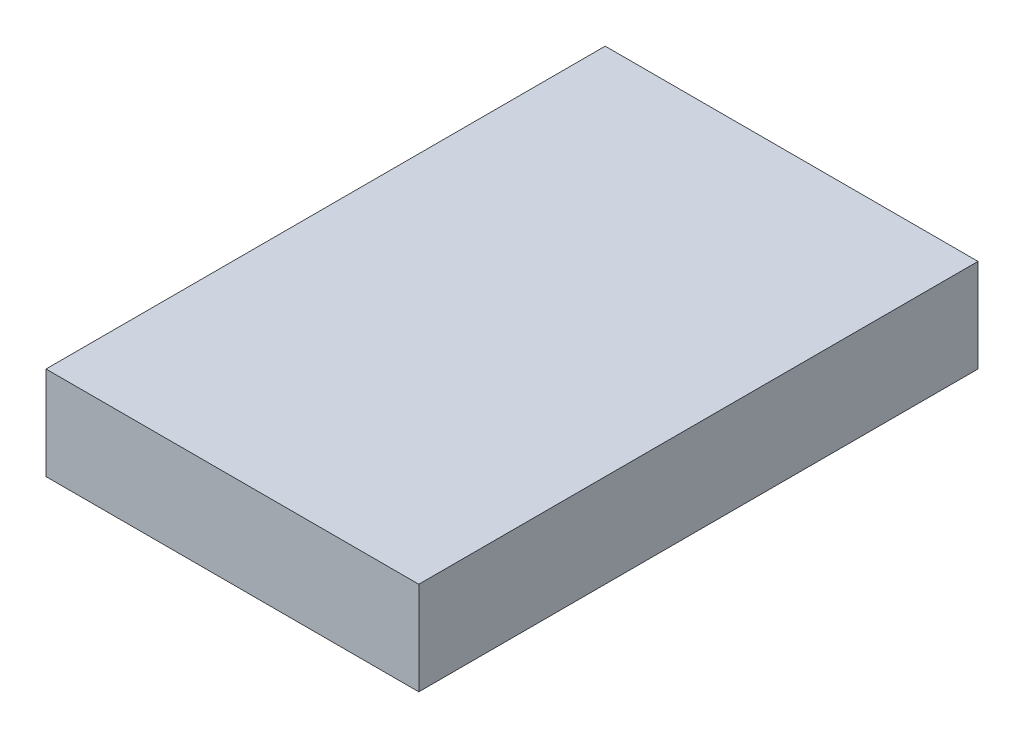
ISO-10303-21;
HEADER;
FILE_DESCRIPTION(('STEP AP214'),'2;1');
FILE_NAME('part.step','',(''),(''),'','','');
FILE_SCHEMA(('AUTOMOTIVE_DESIGN { 1 0 10303 214 1 1 1 1 }'));
ENDSEC;
DATA;
#1=APPLICATION_CONTEXT('core data for automotive mechanical design processes');
#2=APPLICATION_PROTOCOL_DEFINITION('international standard','automotive_design',2000,#1);
#3=PRODUCT_CONTEXT('',#1,'mechanical');
#4=PRODUCT('Part','Part','',(#3));
#5=PRODUCT_RELATED_PRODUCT_CATEGORY('part','',(#4));
#6=PRODUCT_DEFINITION_FORMATION('','',#4);
#7=PRODUCT_DEFINITION_CONTEXT('part definition',#1,'design');
#8=PRODUCT_DEFINITION('design','',#6,#7);
#9=PRODUCT_DEFINITION_SHAPE('','',#8);
#10=(LENGTH_UNIT() NAMED_UNIT(*) SI_UNIT(.MILLI.,.METRE.));
#11=(NAMED_UNIT(*) PLANE_ANGLE_UNIT() SI_UNIT($,.RADIAN.));
#12=(NAMED_UNIT(*) SI_UNIT($,.STERADIAN.) SOLID_ANGLE_UNIT());
#13=UNCERTAINTY_MEASURE_WITH_UNIT(LENGTH_MEASURE(1.E-05),#10,'distance_accuracy_value','');
#14=(GEOMETRIC_REPRESENTATION_CONTEXT(3) GLOBAL_UNCERTAINTY_ASSIGNED_CONTEXT((#13)) GLOBAL_UNIT_ASSIGNED_CONTEXT((#10,
#11,#12)) REPRESENTATION_CONTEXT('',''));
#15=CARTESIAN_POINT('',(0.,0.,0.));
#16=DIRECTION('',(0.,0.,1.));
#17=DIRECTION('',(1.,0.,0.));
#18=AXIS2_PLACEMENT_3D('',#15,#16,#17);
#19=CARTESIAN_POINT('',(20.,5.,60.));
#20=DIRECTION('',(-1.,0.,0.));
#21=DIRECTION('',(0.,0.,1.));
#22=AXIS2_PLACEMENT_3D('',#19,#20,#21);
#23=PLANE('',#22);
#24=DIRECTION('',(0.,1.,0.));
#25=VECTOR('',#24,1.);
#26=CARTESIAN_POINT('',(20.,5.,0.));
#27=LINE('',#26,#25);
#28=CARTESIAN_POINT('',(20.,-5.,0.));
#29=VERTEX_POINT('',#28);
#30=CARTESIAN_POINT('',(20.,5.,0.));
#31=VERTEX_POINT('',#30);
#32=EDGE_CURVE('E106',#29,#31,#27,.T.);
#33=ORIENTED_EDGE('',*,*,#32,.T.);
#34=DIRECTION('',(0.,0.,-1.));
#35=VECTOR('',#34,1.);
#36=CARTESIAN_POINT('',(20.,5.,60.));
#37=LINE('',#36,#35);
#38=CARTESIAN_POINT('',(20.,5.,60.));
#39=VERTEX_POINT('',#38);
#40=EDGE_CURVE('E11',#39,#31,#37,.T.);
#41=ORIENTED_EDGE('',*,*,#40,.F.);
#42=DIRECTION('',(0.,1.,0.));
#43=VECTOR('',#42,1.);
#44=CARTESIAN_POINT('',(20.,5.,60.));
#45=LINE('',#44,#43);
#46=CARTESIAN_POINT('',(20.,-5.,60.));
#47=VERTEX_POINT('',#46);
#48=EDGE_CURVE('E94',#47,#39,#45,.T.);
#49=ORIENTED_EDGE('',*,*,#48,.F.);
#50=DIRECTION('',(0.,0.,-1.));
#51=VECTOR('',#50,1.);
#52=CARTESIAN_POINT('',(20.,-5.,60.));
#53=LINE('',#52,#51);
#54=EDGE_CURVE('E102',#47,#29,#53,.T.);
#55=ORIENTED_EDGE('',*,*,#54,.T.);
#56=EDGE_LOOP('',(#33,#41,#49,#55));
#57=FACE_BOUND('',#56,.T.);
#58=ADVANCED_FACE('F43',(#57),#23,.F.);
#59=CARTESIAN_POINT('',(-20.,5.,60.));
#60=DIRECTION('',(0.,-1.,0.));
#61=DIRECTION('',(0.,0.,-1.));
#62=AXIS2_PLACEMENT_3D('',#59,#60,#61);
#63=PLANE('',#62);
#64=DIRECTION('',(-1.,0.,0.));
#65=VECTOR('',#64,1.);
#66=CARTESIAN_POINT('',(-20.,5.,0.));
#67=LINE('',#66,#65);
#68=CARTESIAN_POINT('',(-20.,5.,0.));
#69=VERTEX_POINT('',#68);
#70=EDGE_CURVE('E98',#31,#69,#67,.T.);
#71=ORIENTED_EDGE('',*,*,#70,.T.);
#72=DIRECTION('',(0.,0.,-1.));
#73=VECTOR('',#72,1.);
#74=CARTESIAN_POINT('',(-20.,5.,60.));
#75=LINE('',#74,#73);
#76=CARTESIAN_POINT('',(-20.,5.,60.));
#77=VERTEX_POINT('',#76);
#78=EDGE_CURVE('E51',#77,#69,#75,.T.);
#79=ORIENTED_EDGE('',*,*,#78,.F.);
#80=DIRECTION('',(-1.,0.,0.));
#81=VECTOR('',#80,1.);
#82=CARTESIAN_POINT('',(-20.,5.,60.));
#83=LINE('',#82,#81);
#84=EDGE_CURVE('E89',#39,#77,#83,.T.);
#85=ORIENTED_EDGE('',*,*,#84,.F.);
#86=ORIENTED_EDGE('',*,*,#40,.T.);
#87=EDGE_LOOP('',(#71,#79,#85,#86));
#88=FACE_BOUND('',#87,.T.);
#89=ADVANCED_FACE('F97',(#88),#63,.F.);
#90=CARTESIAN_POINT('',(-20.,5.,60.));
#91=DIRECTION('',(1.,0.,0.));
#92=DIRECTION('',(0.,0.,-1.));
#93=AXIS2_PLACEMENT_3D('',#90,#91,#92);
#94=PLANE('',#93);
#95=DIRECTION('',(0.,-1.,0.));
#96=VECTOR('',#95,1.);
#97=CARTESIAN_POINT('',(-20.,5.,0.));
#98=LINE('',#97,#96);
#99=CARTESIAN_POINT('',(-20.,-5.,0.));
#100=VERTEX_POINT('',#99);
#101=EDGE_CURVE('E76',#69,#100,#98,.T.);
#102=ORIENTED_EDGE('',*,*,#101,.T.);
#103=DIRECTION('',(0.,0.,-1.));
#104=VECTOR('',#103,1.);
#105=CARTESIAN_POINT('',(-20.,-5.,60.));
#106=LINE('',#105,#104);
#107=CARTESIAN_POINT('',(-20.,-5.,60.));
#108=VERTEX_POINT('',#107);
#109=EDGE_CURVE('E99',#108,#100,#106,.T.);
#110=ORIENTED_EDGE('',*,*,#109,.F.);
#111=DIRECTION('',(0.,-1.,0.));
#112=VECTOR('',#111,1.);
#113=CARTESIAN_POINT('',(-20.,5.,60.));
#114=LINE('',#113,#112);
#115=EDGE_CURVE('E92',#77,#108,#114,.T.);
#116=ORIENTED_EDGE('',*,*,#115,.F.);
#117=ORIENTED_EDGE('',*,*,#78,.T.);
#118=EDGE_LOOP('',(#102,#110,#116,#117));
#119=FACE_BOUND('',#118,.T.);
#120=ADVANCED_FACE('F100',(#119),#94,.F.);
#121=CARTESIAN_POINT('',(-20.,-5.,60.));
#122=DIRECTION('',(0.,1.,0.));
#123=DIRECTION('',(0.,0.,1.));
#124=AXIS2_PLACEMENT_3D('',#121,#122,#123);
#125=PLANE('',#124);
#126=DIRECTION('',(1.,0.,0.));
#127=VECTOR('',#126,1.);
#128=CARTESIAN_POINT('',(-20.,-5.,0.));
#129=LINE('',#128,#127);
#130=EDGE_CURVE('E82',#100,#29,#129,.T.);
#131=ORIENTED_EDGE('',*,*,#130,.T.);
#132=ORIENTED_EDGE('',*,*,#54,.F.);
#133=DIRECTION('',(1.,0.,0.));
#134=VECTOR('',#133,1.);
#135=CARTESIAN_POINT('',(-20.,-5.,60.));
#136=LINE('',#135,#134);
#137=EDGE_CURVE('E59',#108,#47,#136,.T.);
#138=ORIENTED_EDGE('',*,*,#137,.F.);
#139=ORIENTED_EDGE('',*,*,#109,.T.);
#140=EDGE_LOOP('',(#131,#132,#138,#139));
#141=FACE_BOUND('',#140,.T.);
#142=ADVANCED_FACE('F114',(#141),#125,.F.);
#143=CARTESIAN_POINT('',(0.,0.,60.));
#144=DIRECTION('',(0.,0.,1.));
#145=DIRECTION('',(1.,0.,0.));
#146=AXIS2_PLACEMENT_3D('',#143,#144,#145);
#147=PLANE('',#146);
#148=ORIENTED_EDGE('',*,*,#48,.T.);
#149=ORIENTED_EDGE('',*,*,#84,.T.);
#150=ORIENTED_EDGE('',*,*,#115,.T.);
#151=ORIENTED_EDGE('',*,*,#137,.T.);
#152=EDGE_LOOP('',(#148,#149,#150,#151));
#153=FACE_BOUND('',#152,.T.);
#154=ADVANCED_FACE('F90',(#153),#147,.T.);
#155=CARTESIAN_POINT('',(0.,0.,0.));
#156=DIRECTION('',(0.,0.,1.));
#157=DIRECTION('',(1.,0.,0.));
#158=AXIS2_PLACEMENT_3D('',#155,#156,#157);
#159=PLANE('',#158);
#160=ORIENTED_EDGE('',*,*,#32,.F.);
#161=ORIENTED_EDGE('',*,*,#130,.F.);
#162=ORIENTED_EDGE('',*,*,#101,.F.);
#163=ORIENTED_EDGE('',*,*,#70,.F.);
#164=EDGE_LOOP('',(#160,#161,#162,#163));
#165=FACE_BOUND('',#164,.T.);
#166=ADVANCED_FACE('F117',(#165),#159,.F.);
#167=CLOSED_SHELL('',(#58,#89,#120,#142,#154,#166));
#168=CARTESIAN_POINT('',(0.,0.,50.));
#169=DIRECTION('',(0.,0.,-1.));
#170=DIRECTION('',(-1.,0.,0.));
#171=AXIS2_PLACEMENT_3D('',#168,#169,#170);
#172=PLANE('',#171);
#173=CARTESIAN_POINT('',(0.,0.,50.));
#174=DIRECTION('',(0.,0.,-1.));
#175=DIRECTION('',(-1.,0.,0.));
#176=AXIS2_PLACEMENT_3D('',#173,#174,#175);
#177=CIRCLE('',#176,0.5);
#178=CARTESIAN_POINT('',(-0.499999999999994,0.,50.));
#179=VERTEX_POINT('',#178);
#180=EDGE_CURVE('E203',#179,#179,#177,.T.);
#181=ORIENTED_EDGE('',*,*,#180,.T.);
#182=EDGE_LOOP('',(#181));
#183=FACE_BOUND('',#182,.T.);
#184=ADVANCED_FACE('F207',(#183),#172,.T.);
#185=CARTESIAN_POINT('',(0.,0.,5.99999999999998));
#186=DIRECTION('',(0.,0.,-1.));
#187=DIRECTION('',(-1.,0.,0.));
#188=AXIS2_PLACEMENT_3D('',#185,#186,#187);
#189=PLANE('',#188);
#190=CARTESIAN_POINT('',(0.,0.,5.99999999999998));
#191=DIRECTION('',(0.,0.,-1.));
#192=DIRECTION('',(-1.,0.,0.));
#193=AXIS2_PLACEMENT_3D('',#190,#191,#192);
#194=CIRCLE('',#193,0.5);
#195=CARTESIAN_POINT('',(-0.5,0.,5.99999999999998));
#196=VERTEX_POINT('',#195);
#197=EDGE_CURVE('E109',#196,#196,#194,.T.);
#198=ORIENTED_EDGE('',*,*,#197,.F.);
#199=EDGE_LOOP('',(#198));
#200=FACE_BOUND('',#199,.T.);
#201=ADVANCED_FACE('F212',(#200),#189,.F.);
#202=CARTESIAN_POINT('',(0.,0.,50.));
#203=DIRECTION('',(0.,0.,-1.));
#204=DIRECTION('',(-1.,0.,0.));
#205=AXIS2_PLACEMENT_3D('',#202,#203,#204);
#206=CYLINDRICAL_SURFACE('',#205,0.5);
#207=CARTESIAN_POINT('',(0.,0.,46.));
#208=DIRECTION('',(0.,0.,-1.));
#209=DIRECTION('',(-1.,0.,0.));
#210=AXIS2_PLACEMENT_3D('',#207,#208,#209);
#211=CIRCLE('',#210,0.5);
#212=CARTESIAN_POINT('',(-0.499999999999994,0.,46.));
#213=VERTEX_POINT('',#212);
#214=EDGE_CURVE('E200',#213,#213,#211,.T.);
#215=ORIENTED_EDGE('',*,*,#214,.T.);
#216=EDGE_LOOP('',(#215));
#217=FACE_BOUND('',#216,.T.);
#218=ORIENTED_EDGE('',*,*,#180,.F.);
#219=EDGE_LOOP('',(#218));
#220=FACE_BOUND('',#219,.T.);
#221=ADVANCED_FACE('F209',(#217,#220),#206,.F.);
#222=CARTESIAN_POINT('',(1.00000000000001,0.,46.));
#223=DIRECTION('',(0.,-1.,0.));
#224=DIRECTION('',(0.,0.,-1.));
#225=AXIS2_PLACEMENT_3D('',#222,#223,#224);
#226=TOROIDAL_SURFACE('',#225,0.999999999999999,0.5);
#227=CARTESIAN_POINT('',(1.00000000000001,0.,45.));
#228=DIRECTION('',(1.,0.,0.));
#229=DIRECTION('',(0.,0.,-1.));
#230=AXIS2_PLACEMENT_3D('',#227,#228,#229);
#231=CIRCLE('',#230,0.5);
#232=CARTESIAN_POINT('',(1.00000000000001,0.,44.5));
#233=VERTEX_POINT('',#232);
#234=EDGE_CURVE('E197',#233,#233,#231,.T.);
#235=CARTESIAN_POINT('',(1.00000000000001,0.,46.));
#236=DIRECTION('',(0.,-1.,0.));
#237=DIRECTION('',(0.,0.,-1.));
#238=AXIS2_PLACEMENT_3D('',#235,#236,#237);
#239=CIRCLE('',#238,1.5);
#240=EDGE_CURVE('',#213,#233,#239,.T.);
#241=ORIENTED_EDGE('',*,*,#214,.F.);
#242=ORIENTED_EDGE('',*,*,#234,.T.);
#243=ORIENTED_EDGE('',*,*,#240,.T.);
#244=ORIENTED_EDGE('',*,*,#240,.F.);
#245=EDGE_LOOP('',(#241,#243,#242,#244));
#246=FACE_BOUND('',#245,.T.);
#247=ADVANCED_FACE('F211',(#246),#226,.F.);
#248=CARTESIAN_POINT('',(1.00000000000001,0.,45.));
#249=DIRECTION('',(1.,0.,0.));
#250=DIRECTION('',(0.,0.,-1.));
#251=AXIS2_PLACEMENT_3D('',#248,#249,#250);
#252=CYLINDRICAL_SURFACE('',#251,0.5);
#253=CARTESIAN_POINT('',(15.,0.,45.));
#254=DIRECTION('',(1.,0.,0.));
#255=DIRECTION('',(0.,0.,-1.));
#256=AXIS2_PLACEMENT_3D('',#253,#254,#255);
#257=CIRCLE('',#256,0.5);
#258=CARTESIAN_POINT('',(15.,0.,45.5));
#259=VERTEX_POINT('',#258);
#260=EDGE_CURVE('E194',#259,#259,#257,.T.);
#261=ORIENTED_EDGE('',*,*,#260,.T.);
#262=EDGE_LOOP('',(#261));
#263=FACE_BOUND('',#262,.T.);
#264=ORIENTED_EDGE('',*,*,#234,.F.);
#265=EDGE_LOOP('',(#264));
#266=FACE_BOUND('',#265,.T.);
#267=ADVANCED_FACE('F220',(#263,#266),#252,.F.);
#268=CARTESIAN_POINT('',(15.,0.,43.5));
#269=DIRECTION('',(0.,1.,0.));
#270=DIRECTION('',(0.,0.,1.));
#271=AXIS2_PLACEMENT_3D('',#268,#269,#270);
#272=TOROIDAL_SURFACE('',#271,1.5,0.5);
#273=CARTESIAN_POINT('',(15.,0.,42.));
#274=DIRECTION('',(-1.,0.,0.));
#275=DIRECTION('',(0.,0.,1.));
#276=AXIS2_PLACEMENT_3D('',#273,#274,#275);
#277=CIRCLE('',#276,0.5);
#278=CARTESIAN_POINT('',(15.,0.,41.5));
#279=VERTEX_POINT('',#278);
#280=EDGE_CURVE('E191',#279,#279,#277,.T.);
#281=CARTESIAN_POINT('',(15.,0.,43.5));
#282=DIRECTION('',(0.,1.,0.));
#283=DIRECTION('',(0.,0.,1.));
#284=AXIS2_PLACEMENT_3D('',#281,#282,#283);
#285=CIRCLE('',#284,2.);
#286=EDGE_CURVE('',#259,#279,#285,.T.);
#287=ORIENTED_EDGE('',*,*,#260,.F.);
#288=ORIENTED_EDGE('',*,*,#280,.T.);
#289=ORIENTED_EDGE('',*,*,#286,.T.);
#290=ORIENTED_EDGE('',*,*,#286,.F.);
#291=EDGE_LOOP('',(#287,#289,#288,#290));
#292=FACE_BOUND('',#291,.T.);
#293=ADVANCED_FACE('F315',(#292),#272,.F.);
#294=CARTESIAN_POINT('',(15.,0.,42.));
#295=DIRECTION('',(-1.,0.,0.));
#296=DIRECTION('',(0.,0.,1.));
#297=AXIS2_PLACEMENT_3D('',#294,#295,#296);
#298=CYLINDRICAL_SURFACE('',#297,0.5);
#299=CARTESIAN_POINT('',(0.,0.,42.));
#300=DIRECTION('',(-1.,0.,0.));
#301=DIRECTION('',(0.,0.,1.));
#302=AXIS2_PLACEMENT_3D('',#299,#300,#301);
#303=CIRCLE('',#302,0.5);
#304=CARTESIAN_POINT('',(0.,0.,42.5));
#305=VERTEX_POINT('',#304);
#306=EDGE_CURVE('E188',#305,#305,#303,.T.);
#307=ORIENTED_EDGE('',*,*,#306,.T.);
#308=EDGE_LOOP('',(#307));
#309=FACE_BOUND('',#308,.T.);
#310=ORIENTED_EDGE('',*,*,#280,.F.);
#311=EDGE_LOOP('',(#310));
#312=FACE_BOUND('',#311,.T.);
#313=ADVANCED_FACE('F325',(#309,#312),#298,.F.);
#314=CARTESIAN_POINT('',(0.,0.,42.));
#315=DIRECTION('',(-1.,0.,0.));
#316=DIRECTION('',(0.,0.,1.));
#317=AXIS2_PLACEMENT_3D('',#314,#315,#316);
#318=CYLINDRICAL_SURFACE('',#317,0.5);
#319=CARTESIAN_POINT('',(-15.,0.,42.));
#320=DIRECTION('',(-1.,0.,0.));
#321=DIRECTION('',(0.,0.,1.));
#322=AXIS2_PLACEMENT_3D('',#319,#320,#321);
#323=CIRCLE('',#322,0.5);
#324=CARTESIAN_POINT('',(-15.,0.,42.5));
#325=VERTEX_POINT('',#324);
#326=EDGE_CURVE('E185',#325,#325,#323,.T.);
#327=ORIENTED_EDGE('',*,*,#326,.T.);
#328=EDGE_LOOP('',(#327));
#329=FACE_BOUND('',#328,.T.);
#330=ORIENTED_EDGE('',*,*,#306,.F.);
#331=EDGE_LOOP('',(#330));
#332=FACE_BOUND('',#331,.T.);
#333=ADVANCED_FACE('F335',(#329,#332),#318,.F.);
#334=CARTESIAN_POINT('',(-15.,0.,40.5));
#335=DIRECTION('',(0.,-1.,0.));
#336=DIRECTION('',(0.,0.,-1.));
#337=AXIS2_PLACEMENT_3D('',#334,#335,#336);
#338=TOROIDAL_SURFACE('',#337,1.5,0.5);
#339=CARTESIAN_POINT('',(-15.,0.,39.));
#340=DIRECTION('',(1.,0.,0.));
#341=DIRECTION('',(0.,0.,-1.));
#342=AXIS2_PLACEMENT_3D('',#339,#340,#341);
#343=CIRCLE('',#342,0.5);
#344=CARTESIAN_POINT('',(-15.,0.,38.5));
#345=VERTEX_POINT('',#344);
#346=EDGE_CURVE('E182',#345,#345,#343,.T.);
#347=CARTESIAN_POINT('',(-15.,0.,40.5));
#348=DIRECTION('',(0.,-1.,0.));
#349=DIRECTION('',(0.,0.,-1.));
#350=AXIS2_PLACEMENT_3D('',#347,#348,#349);
#351=CIRCLE('',#350,2.);
#352=EDGE_CURVE('',#325,#345,#351,.T.);
#353=ORIENTED_EDGE('',*,*,#326,.F.);
#354=ORIENTED_EDGE('',*,*,#346,.T.);
#355=ORIENTED_EDGE('',*,*,#352,.T.);
#356=ORIENTED_EDGE('',*,*,#352,.F.);
#357=EDGE_LOOP('',(#353,#355,#354,#356));
#358=FACE_BOUND('',#357,.T.);
#359=ADVANCED_FACE('F345',(#358),#338,.F.);
#360=CARTESIAN_POINT('',(-15.,0.,39.));
#361=DIRECTION('',(1.,0.,0.));
#362=DIRECTION('',(0.,0.,-1.));
#363=AXIS2_PLACEMENT_3D('',#360,#361,#362);
#364=CYLINDRICAL_SURFACE('',#363,0.5);
#365=CARTESIAN_POINT('',(15.,0.,39.));
#366=DIRECTION('',(1.,0.,0.));
#367=DIRECTION('',(0.,0.,-1.));
#368=AXIS2_PLACEMENT_3D('',#365,#366,#367);
#369=CIRCLE('',#368,0.5);
#370=CARTESIAN_POINT('',(15.,0.,39.5));
#371=VERTEX_POINT('',#370);
#372=EDGE_CURVE('E179',#371,#371,#369,.T.);
#373=ORIENTED_EDGE('',*,*,#372,.T.);
#374=EDGE_LOOP('',(#373));
#375=FACE_BOUND('',#374,.T.);
#376=ORIENTED_EDGE('',*,*,#346,.F.);
#377=EDGE_LOOP('',(#376));
#378=FACE_BOUND('',#377,.T.);
#379=ADVANCED_FACE('F355',(#375,#378),#364,.F.);
#380=CARTESIAN_POINT('',(15.,0.,37.5));
#381=DIRECTION('',(0.,1.,0.));
#382=DIRECTION('',(0.,0.,1.));
#383=AXIS2_PLACEMENT_3D('',#380,#381,#382);
#384=TOROIDAL_SURFACE('',#383,1.49999999999999,0.5);
#385=CARTESIAN_POINT('',(15.,0.,36.));
#386=DIRECTION('',(-1.,0.,0.));
#387=DIRECTION('',(0.,0.,1.));
#388=AXIS2_PLACEMENT_3D('',#385,#386,#387);
#389=CIRCLE('',#388,0.5);
#390=CARTESIAN_POINT('',(15.,0.,35.5));
#391=VERTEX_POINT('',#390);
#392=EDGE_CURVE('E176',#391,#391,#389,.T.);
#393=CARTESIAN_POINT('',(15.,0.,37.5));
#394=DIRECTION('',(0.,1.,0.));
#395=DIRECTION('',(0.,0.,1.));
#396=AXIS2_PLACEMENT_3D('',#393,#394,#395);
#397=CIRCLE('',#396,1.99999999999999);
#398=EDGE_CURVE('',#371,#391,#397,.T.);
#399=ORIENTED_EDGE('',*,*,#372,.F.);
#400=ORIENTED_EDGE('',*,*,#392,.T.);
#401=ORIENTED_EDGE('',*,*,#398,.T.);
#402=ORIENTED_EDGE('',*,*,#398,.F.);
#403=EDGE_LOOP('',(#399,#401,#400,#402));
#404=FACE_BOUND('',#403,.T.);
#405=ADVANCED_FACE('F365',(#404),#384,.F.);
#406=CARTESIAN_POINT('',(15.,0.,36.));
#407=DIRECTION('',(-1.,0.,0.));
#408=DIRECTION('',(0.,0.,1.));
#409=AXIS2_PLACEMENT_3D('',#406,#407,#408);
#410=CYLINDRICAL_SURFACE('',#409,0.5);
#411=CARTESIAN_POINT('',(-15.,0.,36.));
#412=DIRECTION('',(-1.,0.,0.));
#413=DIRECTION('',(0.,0.,1.));
#414=AXIS2_PLACEMENT_3D('',#411,#412,#413);
#415=CIRCLE('',#414,0.5);
#416=CARTESIAN_POINT('',(-15.,0.,36.5));
#417=VERTEX_POINT('',#416);
#418=EDGE_CURVE('E173',#417,#417,#415,.T.);
#419=ORIENTED_EDGE('',*,*,#418,.T.);
#420=EDGE_LOOP('',(#419));
#421=FACE_BOUND('',#420,.T.);
#422=ORIENTED_EDGE('',*,*,#392,.F.);
#423=EDGE_LOOP('',(#422));
#424=FACE_BOUND('',#423,.T.);
#425=ADVANCED_FACE('F375',(#421,#424),#410,.F.);
#426=CARTESIAN_POINT('',(-15.,0.,34.5));
#427=DIRECTION('',(0.,-1.,0.));
#428=DIRECTION('',(0.,0.,-1.));
#429=AXIS2_PLACEMENT_3D('',#426,#427,#428);
#430=TOROIDAL_SURFACE('',#429,1.5,0.5);
#431=CARTESIAN_POINT('',(-15.,0.,33.));
#432=DIRECTION('',(1.,0.,0.));
#433=DIRECTION('',(0.,0.,-1.));
#434=AXIS2_PLACEMENT_3D('',#431,#432,#433);
#435=CIRCLE('',#434,0.5);
#436=CARTESIAN_POINT('',(-15.,0.,32.5));
#437=VERTEX_POINT('',#436);
#438=EDGE_CURVE('E170',#437,#437,#435,.T.);
#439=CARTESIAN_POINT('',(-15.,0.,34.5));
#440=DIRECTION('',(0.,-1.,0.));
#441=DIRECTION('',(0.,0.,-1.));
#442=AXIS2_PLACEMENT_3D('',#439,#440,#441);
#443=CIRCLE('',#442,2.);
#444=EDGE_CURVE('',#417,#437,#443,.T.);
#445=ORIENTED_EDGE('',*,*,#418,.F.);
#446=ORIENTED_EDGE('',*,*,#438,.T.);
#447=ORIENTED_EDGE('',*,*,#444,.T.);
#448=ORIENTED_EDGE('',*,*,#444,.F.);
#449=EDGE_LOOP('',(#445,#447,#446,#448));
#450=FACE_BOUND('',#449,.T.);
#451=ADVANCED_FACE('F385',(#450),#430,.F.);
#452=CARTESIAN_POINT('',(-15.,0.,33.));
#453=DIRECTION('',(1.,0.,0.));
#454=DIRECTION('',(0.,0.,-1.));
#455=AXIS2_PLACEMENT_3D('',#452,#453,#454);
#456=CYLINDRICAL_SURFACE('',#455,0.5);
#457=CARTESIAN_POINT('',(15.3555796644881,0.,33.));
#458=DIRECTION('',(1.,0.,0.));
#459=DIRECTION('',(0.,0.,-1.));
#460=AXIS2_PLACEMENT_3D('',#457,#458,#459);
#461=CIRCLE('',#460,0.5);
#462=CARTESIAN_POINT('',(15.3555796644881,0.,33.5));
#463=VERTEX_POINT('',#462);
#464=EDGE_CURVE('E167',#463,#463,#461,.T.);
#465=ORIENTED_EDGE('',*,*,#464,.T.);
#466=EDGE_LOOP('',(#465));
#467=FACE_BOUND('',#466,.T.);
#468=ORIENTED_EDGE('',*,*,#438,.F.);
#469=EDGE_LOOP('',(#468));
#470=FACE_BOUND('',#469,.T.);
#471=ADVANCED_FACE('F395',(#467,#470),#456,.F.);
#472=CARTESIAN_POINT('',(15.3555796644881,0.,31.5));
#473=DIRECTION('',(0.,1.,0.));
#474=DIRECTION('',(0.,0.,1.));
#475=AXIS2_PLACEMENT_3D('',#472,#473,#474);
#476=TOROIDAL_SURFACE('',#475,1.49999999999999,0.5);
#477=CARTESIAN_POINT('',(15.3555796644881,0.,30.));
#478=DIRECTION('',(-1.,0.,0.));
#479=DIRECTION('',(0.,0.,1.));
#480=AXIS2_PLACEMENT_3D('',#477,#478,#479);
#481=CIRCLE('',#480,0.5);
#482=CARTESIAN_POINT('',(15.3555796644881,0.,29.5));
#483=VERTEX_POINT('',#482);
#484=EDGE_CURVE('E164',#483,#483,#481,.T.);
#485=CARTESIAN_POINT('',(15.3555796644881,0.,31.5));
#486=DIRECTION('',(0.,1.,0.));
#487=DIRECTION('',(0.,0.,1.));
#488=AXIS2_PLACEMENT_3D('',#485,#486,#487);
#489=CIRCLE('',#488,1.99999999999999);
#490=EDGE_CURVE('',#463,#483,#489,.T.);
#491=ORIENTED_EDGE('',*,*,#464,.F.);
#492=ORIENTED_EDGE('',*,*,#484,.T.);
#493=ORIENTED_EDGE('',*,*,#490,.T.);
#494=ORIENTED_EDGE('',*,*,#490,.F.);
#495=EDGE_LOOP('',(#491,#493,#492,#494));
#496=FACE_BOUND('',#495,.T.);
#497=ADVANCED_FACE('F405',(#496),#476,.F.);
#498=CARTESIAN_POINT('',(15.3555796644881,0.,30.));
#499=DIRECTION('',(-1.,0.,0.));
#500=DIRECTION('',(0.,0.,1.));
#501=AXIS2_PLACEMENT_3D('',#498,#499,#500);
#502=CYLINDRICAL_SURFACE('',#501,0.5);
#503=CARTESIAN_POINT('',(-15.,0.,30.));
#504=DIRECTION('',(-1.,0.,0.));
#505=DIRECTION('',(0.,0.,1.));
#506=AXIS2_PLACEMENT_3D('',#503,#504,#505);
#507=CIRCLE('',#506,0.5);
#508=CARTESIAN_POINT('',(-15.,0.,30.5));
#509=VERTEX_POINT('',#508);
#510=EDGE_CURVE('E161',#509,#509,#507,.T.);
#511=ORIENTED_EDGE('',*,*,#510,.T.);
#512=EDGE_LOOP('',(#511));
#513=FACE_BOUND('',#512,.T.);
#514=ORIENTED_EDGE('',*,*,#484,.F.);
#515=EDGE_LOOP('',(#514));
#516=FACE_BOUND('',#515,.T.);
#517=ADVANCED_FACE('F415',(#513,#516),#502,.F.);
#518=CARTESIAN_POINT('',(-15.,0.,28.5));
#519=DIRECTION('',(0.,-1.,0.));
#520=DIRECTION('',(0.,0.,-1.));
#521=AXIS2_PLACEMENT_3D('',#518,#519,#520);
#522=TOROIDAL_SURFACE('',#521,1.5,0.5);
#523=CARTESIAN_POINT('',(-15.,0.,27.));
#524=DIRECTION('',(1.,0.,0.));
#525=DIRECTION('',(0.,0.,-1.));
#526=AXIS2_PLACEMENT_3D('',#523,#524,#525);
#527=CIRCLE('',#526,0.5);
#528=CARTESIAN_POINT('',(-15.,0.,26.5));
#529=VERTEX_POINT('',#528);
#530=EDGE_CURVE('E158',#529,#529,#527,.T.);
#531=CARTESIAN_POINT('',(-15.,0.,28.5));
#532=DIRECTION('',(0.,-1.,0.));
#533=DIRECTION('',(0.,0.,-1.));
#534=AXIS2_PLACEMENT_3D('',#531,#532,#533);
#535=CIRCLE('',#534,2.);
#536=EDGE_CURVE('',#509,#529,#535,.T.);
#537=ORIENTED_EDGE('',*,*,#510,.F.);
#538=ORIENTED_EDGE('',*,*,#530,.T.);
#539=ORIENTED_EDGE('',*,*,#536,.T.);
#540=ORIENTED_EDGE('',*,*,#536,.F.);
#541=EDGE_LOOP('',(#537,#539,#538,#540));
#542=FACE_BOUND('',#541,.T.);
#543=ADVANCED_FACE('F425',(#542),#522,.F.);
#544=CARTESIAN_POINT('',(-15.,0.,27.));
#545=DIRECTION('',(1.,0.,0.));
#546=DIRECTION('',(0.,0.,-1.));
#547=AXIS2_PLACEMENT_3D('',#544,#545,#546);
#548=CYLINDRICAL_SURFACE('',#547,0.5);
#549=CARTESIAN_POINT('',(15.,0.,27.));
#550=DIRECTION('',(1.,0.,0.));
#551=DIRECTION('',(0.,0.,-1.));
#552=AXIS2_PLACEMENT_3D('',#549,#550,#551);
#553=CIRCLE('',#552,0.5);
#554=CARTESIAN_POINT('',(15.,0.,27.5));
#555=VERTEX_POINT('',#554);
#556=EDGE_CURVE('E155',#555,#555,#553,.T.);
#557=ORIENTED_EDGE('',*,*,#556,.T.);
#558=EDGE_LOOP('',(#557));
#559=FACE_BOUND('',#558,.T.);
#560=ORIENTED_EDGE('',*,*,#530,.F.);
#561=EDGE_LOOP('',(#560));
#562=FACE_BOUND('',#561,.T.);
#563=ADVANCED_FACE('F435',(#559,#562),#548,.F.);
#564=CARTESIAN_POINT('',(15.,0.,25.5));
#565=DIRECTION('',(0.,1.,0.));
#566=DIRECTION('',(0.,0.,1.));
#567=AXIS2_PLACEMENT_3D('',#564,#565,#566);
#568=TOROIDAL_SURFACE('',#567,1.5,0.5);
#569=CARTESIAN_POINT('',(15.,0.,24.));
#570=DIRECTION('',(-1.,0.,0.));
#571=DIRECTION('',(0.,0.,1.));
#572=AXIS2_PLACEMENT_3D('',#569,#570,#571);
#573=CIRCLE('',#572,0.5);
#574=CARTESIAN_POINT('',(15.,0.,23.5));
#575=VERTEX_POINT('',#574);
#576=EDGE_CURVE('E152',#575,#575,#573,.T.);
#577=CARTESIAN_POINT('',(15.,0.,25.5));
#578=DIRECTION('',(0.,1.,0.));
#579=DIRECTION('',(0.,0.,1.));
#580=AXIS2_PLACEMENT_3D('',#577,#578,#579);
#581=CIRCLE('',#580,2.);
#582=EDGE_CURVE('',#555,#575,#581,.T.);
#583=ORIENTED_EDGE('',*,*,#556,.F.);
#584=ORIENTED_EDGE('',*,*,#576,.T.);
#585=ORIENTED_EDGE('',*,*,#582,.T.);
#586=ORIENTED_EDGE('',*,*,#582,.F.);
#587=EDGE_LOOP('',(#583,#585,#584,#586));
#588=FACE_BOUND('',#587,.T.);
#589=ADVANCED_FACE('F445',(#588),#568,.F.);
#590=CARTESIAN_POINT('',(15.,0.,24.));
#591=DIRECTION('',(-1.,0.,0.));
#592=DIRECTION('',(0.,0.,1.));
#593=AXIS2_PLACEMENT_3D('',#590,#591,#592);
#594=CYLINDRICAL_SURFACE('',#593,0.5);
#595=CARTESIAN_POINT('',(-15.,0.,24.));
#596=DIRECTION('',(-1.,0.,0.));
#597=DIRECTION('',(0.,0.,1.));
#598=AXIS2_PLACEMENT_3D('',#595,#596,#597);
#599=CIRCLE('',#598,0.5);
#600=CARTESIAN_POINT('',(-15.,0.,24.5));
#601=VERTEX_POINT('',#600);
#602=EDGE_CURVE('E149',#601,#601,#599,.T.);
#603=ORIENTED_EDGE('',*,*,#602,.T.);
#604=EDGE_LOOP('',(#603));
#605=FACE_BOUND('',#604,.T.);
#606=ORIENTED_EDGE('',*,*,#576,.F.);
#607=EDGE_LOOP('',(#606));
#608=FACE_BOUND('',#607,.T.);
#609=ADVANCED_FACE('F455',(#605,#608),#594,.F.);
#610=CARTESIAN_POINT('',(-15.,0.,22.5));
#611=DIRECTION('',(0.,-1.,0.));
#612=DIRECTION('',(0.,0.,-1.));
#613=AXIS2_PLACEMENT_3D('',#610,#611,#612);
#614=TOROIDAL_SURFACE('',#613,1.5,0.5);
#615=CARTESIAN_POINT('',(-15.,0.,21.));
#616=DIRECTION('',(1.,0.,0.));
#617=DIRECTION('',(0.,0.,-1.));
#618=AXIS2_PLACEMENT_3D('',#615,#616,#617);
#619=CIRCLE('',#618,0.5);
#620=CARTESIAN_POINT('',(-15.,0.,20.5));
#621=VERTEX_POINT('',#620);
#622=EDGE_CURVE('E146',#621,#621,#619,.T.);
#623=CARTESIAN_POINT('',(-15.,0.,22.5));
#624=DIRECTION('',(0.,-1.,0.));
#625=DIRECTION('',(0.,0.,-1.));
#626=AXIS2_PLACEMENT_3D('',#623,#624,#625);
#627=CIRCLE('',#626,2.);
#628=EDGE_CURVE('',#601,#621,#627,.T.);
#629=ORIENTED_EDGE('',*,*,#602,.F.);
#630=ORIENTED_EDGE('',*,*,#622,.T.);
#631=ORIENTED_EDGE('',*,*,#628,.T.);
#632=ORIENTED_EDGE('',*,*,#628,.F.);
#633=EDGE_LOOP('',(#629,#631,#630,#632));
#634=FACE_BOUND('',#633,.T.);
#635=ADVANCED_FACE('F465',(#634),#614,.F.);
#636=CARTESIAN_POINT('',(-15.,0.,21.));
#637=DIRECTION('',(1.,0.,0.));
#638=DIRECTION('',(0.,0.,-1.));
#639=AXIS2_PLACEMENT_3D('',#636,#637,#638);
#640=CYLINDRICAL_SURFACE('',#639,0.5);
#641=CARTESIAN_POINT('',(15.,0.,21.));
#642=DIRECTION('',(1.,0.,0.));
#643=DIRECTION('',(0.,0.,-1.));
#644=AXIS2_PLACEMENT_3D('',#641,#642,#643);
#645=CIRCLE('',#644,0.5);
#646=CARTESIAN_POINT('',(15.,0.,21.5));
#647=VERTEX_POINT('',#646);
#648=EDGE_CURVE('E143',#647,#647,#645,.T.);
#649=ORIENTED_EDGE('',*,*,#648,.T.);
#650=EDGE_LOOP('',(#649));
#651=FACE_BOUND('',#650,.T.);
#652=ORIENTED_EDGE('',*,*,#622,.F.);
#653=EDGE_LOOP('',(#652));
#654=FACE_BOUND('',#653,.T.);
#655=ADVANCED_FACE('F475',(#651,#654),#640,.F.);
#656=CARTESIAN_POINT('',(15.,0.,19.5));
#657=DIRECTION('',(0.,1.,0.));
#658=DIRECTION('',(0.,0.,1.));
#659=AXIS2_PLACEMENT_3D('',#656,#657,#658);
#660=TOROIDAL_SURFACE('',#659,1.5,0.5);
#661=CARTESIAN_POINT('',(15.,0.,18.));
#662=DIRECTION('',(-1.,0.,0.));
#663=DIRECTION('',(0.,0.,1.));
#664=AXIS2_PLACEMENT_3D('',#661,#662,#663);
#665=CIRCLE('',#664,0.5);
#666=CARTESIAN_POINT('',(15.,0.,17.5));
#667=VERTEX_POINT('',#666);
#668=EDGE_CURVE('E140',#667,#667,#665,.T.);
#669=CARTESIAN_POINT('',(15.,0.,19.5));
#670=DIRECTION('',(0.,1.,0.));
#671=DIRECTION('',(0.,0.,1.));
#672=AXIS2_PLACEMENT_3D('',#669,#670,#671);
#673=CIRCLE('',#672,2.);
#674=EDGE_CURVE('',#647,#667,#673,.T.);
#675=ORIENTED_EDGE('',*,*,#648,.F.);
#676=ORIENTED_EDGE('',*,*,#668,.T.);
#677=ORIENTED_EDGE('',*,*,#674,.T.);
#678=ORIENTED_EDGE('',*,*,#674,.F.);
#679=EDGE_LOOP('',(#675,#677,#676,#678));
#680=FACE_BOUND('',#679,.T.);
#681=ADVANCED_FACE('F485',(#680),#660,.F.);
#682=CARTESIAN_POINT('',(15.,0.,18.));
#683=DIRECTION('',(-1.,0.,0.));
#684=DIRECTION('',(0.,0.,1.));
#685=AXIS2_PLACEMENT_3D('',#682,#683,#684);
#686=CYLINDRICAL_SURFACE('',#685,0.5);
#687=CARTESIAN_POINT('',(-15.,0.,18.));
#688=DIRECTION('',(-1.,0.,0.));
#689=DIRECTION('',(0.,0.,1.));
#690=AXIS2_PLACEMENT_3D('',#687,#688,#689);
#691=CIRCLE('',#690,0.5);
#692=CARTESIAN_POINT('',(-15.,0.,18.5));
#693=VERTEX_POINT('',#692);
#694=EDGE_CURVE('E137',#693,#693,#691,.T.);
#695=ORIENTED_EDGE('',*,*,#694,.T.);
#696=EDGE_LOOP('',(#695));
#697=FACE_BOUND('',#696,.T.);
#698=ORIENTED_EDGE('',*,*,#668,.F.);
#699=EDGE_LOOP('',(#698));
#700=FACE_BOUND('',#699,.T.);
#701=ADVANCED_FACE('F495',(#697,#700),#686,.F.);
#702=CARTESIAN_POINT('',(-15.,0.,16.5));
#703=DIRECTION('',(0.,-1.,0.));
#704=DIRECTION('',(0.,0.,-1.));
#705=AXIS2_PLACEMENT_3D('',#702,#703,#704);
#706=TOROIDAL_SURFACE('',#705,1.49999999999999,0.5);
#707=CARTESIAN_POINT('',(-15.,0.,15.));
#708=DIRECTION('',(1.,0.,0.));
#709=DIRECTION('',(0.,0.,-1.));
#710=AXIS2_PLACEMENT_3D('',#707,#708,#709);
#711=CIRCLE('',#710,0.5);
#712=CARTESIAN_POINT('',(-15.,0.,14.5));
#713=VERTEX_POINT('',#712);
#714=EDGE_CURVE('E134',#713,#713,#711,.T.);
#715=CARTESIAN_POINT('',(-15.,0.,16.5));
#716=DIRECTION('',(0.,-1.,0.));
#717=DIRECTION('',(0.,0.,-1.));
#718=AXIS2_PLACEMENT_3D('',#715,#716,#717);
#719=CIRCLE('',#718,1.99999999999999);
#720=EDGE_CURVE('',#693,#713,#719,.T.);
#721=ORIENTED_EDGE('',*,*,#694,.F.);
#722=ORIENTED_EDGE('',*,*,#714,.T.);
#723=ORIENTED_EDGE('',*,*,#720,.T.);
#724=ORIENTED_EDGE('',*,*,#720,.F.);
#725=EDGE_LOOP('',(#721,#723,#722,#724));
#726=FACE_BOUND('',#725,.T.);
#727=ADVANCED_FACE('F505',(#726),#706,.F.);
#728=CARTESIAN_POINT('',(-15.,0.,15.));
#729=DIRECTION('',(1.,0.,0.));
#730=DIRECTION('',(0.,0.,-1.));
#731=AXIS2_PLACEMENT_3D('',#728,#729,#730);
#732=CYLINDRICAL_SURFACE('',#731,0.5);
#733=CARTESIAN_POINT('',(15.,0.,15.));
#734=DIRECTION('',(1.,0.,0.));
#735=DIRECTION('',(0.,0.,-1.));
#736=AXIS2_PLACEMENT_3D('',#733,#734,#735);
#737=CIRCLE('',#736,0.5);
#738=CARTESIAN_POINT('',(15.,0.,15.5));
#739=VERTEX_POINT('',#738);
#740=EDGE_CURVE('E131',#739,#739,#737,.T.);
#741=ORIENTED_EDGE('',*,*,#740,.T.);
#742=EDGE_LOOP('',(#741));
#743=FACE_BOUND('',#742,.T.);
#744=ORIENTED_EDGE('',*,*,#714,.F.);
#745=EDGE_LOOP('',(#744));
#746=FACE_BOUND('',#745,.T.);
#747=ADVANCED_FACE('F515',(#743,#746),#732,.F.);
#748=CARTESIAN_POINT('',(15.,0.,13.5));
#749=DIRECTION('',(0.,1.,0.));
#750=DIRECTION('',(0.,0.,1.));
#751=AXIS2_PLACEMENT_3D('',#748,#749,#750);
#752=TOROIDAL_SURFACE('',#751,1.5,0.5);
#753=CARTESIAN_POINT('',(15.,0.,12.));
#754=DIRECTION('',(-1.,0.,0.));
#755=DIRECTION('',(0.,0.,1.));
#756=AXIS2_PLACEMENT_3D('',#753,#754,#755);
#757=CIRCLE('',#756,0.5);
#758=CARTESIAN_POINT('',(15.,0.,11.5));
#759=VERTEX_POINT('',#758);
#760=EDGE_CURVE('E128',#759,#759,#757,.T.);
#761=CARTESIAN_POINT('',(15.,0.,13.5));
#762=DIRECTION('',(0.,1.,0.));
#763=DIRECTION('',(0.,0.,1.));
#764=AXIS2_PLACEMENT_3D('',#761,#762,#763);
#765=CIRCLE('',#764,2.);
#766=EDGE_CURVE('',#739,#759,#765,.T.);
#767=ORIENTED_EDGE('',*,*,#740,.F.);
#768=ORIENTED_EDGE('',*,*,#760,.T.);
#769=ORIENTED_EDGE('',*,*,#766,.T.);
#770=ORIENTED_EDGE('',*,*,#766,.F.);
#771=EDGE_LOOP('',(#767,#769,#768,#770));
#772=FACE_BOUND('',#771,.T.);
#773=ADVANCED_FACE('F525',(#772),#752,.F.);
#774=CARTESIAN_POINT('',(15.,0.,12.));
#775=DIRECTION('',(-1.,0.,0.));
#776=DIRECTION('',(0.,0.,1.));
#777=AXIS2_PLACEMENT_3D('',#774,#775,#776);
#778=CYLINDRICAL_SURFACE('',#777,0.5);
#779=CARTESIAN_POINT('',(1.00000000000001,0.,12.));
#780=DIRECTION('',(-1.,0.,0.));
#781=DIRECTION('',(0.,0.,1.));
#782=AXIS2_PLACEMENT_3D('',#779,#780,#781);
#783=CIRCLE('',#782,0.5);
#784=CARTESIAN_POINT('',(1.00000000000001,0.,12.5));
#785=VERTEX_POINT('',#784);
#786=EDGE_CURVE('E125',#785,#785,#783,.T.);
#787=ORIENTED_EDGE('',*,*,#786,.T.);
#788=EDGE_LOOP('',(#787));
#789=FACE_BOUND('',#788,.T.);
#790=ORIENTED_EDGE('',*,*,#760,.F.);
#791=EDGE_LOOP('',(#790));
#792=FACE_BOUND('',#791,.T.);
#793=ADVANCED_FACE('F234',(#789,#792),#778,.F.);
#794=CARTESIAN_POINT('',(1.,0.,11.));
#795=DIRECTION('',(0.,-1.,0.));
#796=DIRECTION('',(0.,0.,-1.));
#797=AXIS2_PLACEMENT_3D('',#794,#795,#796);
#798=TOROIDAL_SURFACE('',#797,0.999999999999999,0.5);
#799=CARTESIAN_POINT('',(0.,0.,11.));
#800=DIRECTION('',(0.,0.,-1.));
#801=DIRECTION('',(-1.,0.,0.));
#802=AXIS2_PLACEMENT_3D('',#799,#800,#801);
#803=CIRCLE('',#802,0.5);
#804=CARTESIAN_POINT('',(-0.499999999999998,0.,11.));
#805=VERTEX_POINT('',#804);
#806=EDGE_CURVE('E122',#805,#805,#803,.T.);
#807=CARTESIAN_POINT('',(1.,0.,11.));
#808=DIRECTION('',(0.,-1.,0.));
#809=DIRECTION('',(0.,0.,-1.));
#810=AXIS2_PLACEMENT_3D('',#807,#808,#809);
#811=CIRCLE('',#810,1.5);
#812=EDGE_CURVE('',#785,#805,#811,.T.);
#813=ORIENTED_EDGE('',*,*,#786,.F.);
#814=ORIENTED_EDGE('',*,*,#806,.T.);
#815=ORIENTED_EDGE('',*,*,#812,.T.);
#816=ORIENTED_EDGE('',*,*,#812,.F.);
#817=EDGE_LOOP('',(#813,#815,#814,#816));
#818=FACE_BOUND('',#817,.T.);
#819=ADVANCED_FACE('F228',(#818),#798,.F.);
#820=CARTESIAN_POINT('',(0.,0.,11.));
#821=DIRECTION('',(0.,0.,-1.));
#822=DIRECTION('',(-1.,0.,0.));
#823=AXIS2_PLACEMENT_3D('',#820,#821,#822);
#824=CYLINDRICAL_SURFACE('',#823,0.5);
#825=ORIENTED_EDGE('',*,*,#197,.T.);
#826=EDGE_LOOP('',(#825));
#827=FACE_BOUND('',#826,.T.);
#828=ORIENTED_EDGE('',*,*,#806,.F.);
#829=EDGE_LOOP('',(#828));
#830=FACE_BOUND('',#829,.T.);
#831=ADVANCED_FACE('F226',(#827,#830),#824,.F.);
#832=CLOSED_SHELL('',(#184,#201,#221,#247,#267,#293,#313,#333,#359,#379,#405,#425,#451,#471,
#497,#517,#543,#563,#589,#609,#635,#655,#681,#701,#727,#747,#773,#793,#819,#831));
#833=ORIENTED_CLOSED_SHELL('',*,#832,.T.);
#834=BREP_WITH_VOIDS('B2',#167,(#833));
#835=ADVANCED_BREP_SHAPE_REPRESENTATION('',(#18,#834),#14);
#836=SHAPE_DEFINITION_REPRESENTATION(#9,#835);
ENDSEC;
END-ISO-10303-21;
